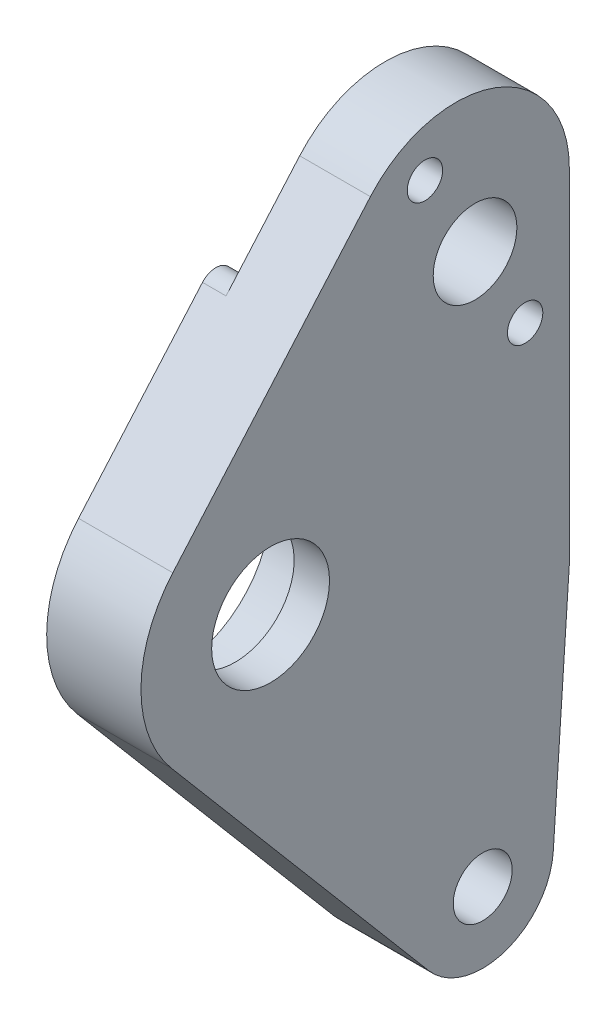
ISO-10303-21;
HEADER;
FILE_DESCRIPTION(('STEP AP214'),'2;1');
FILE_NAME('part.step','',(''),(''),'','','');
FILE_SCHEMA(('AUTOMOTIVE_DESIGN { 1 0 10303 214 1 1 1 1 }'));
ENDSEC;
DATA;
#1=APPLICATION_CONTEXT('core data for automotive mechanical design processes');
#2=APPLICATION_PROTOCOL_DEFINITION('international standard','automotive_design',2000,#1);
#3=PRODUCT_CONTEXT('',#1,'mechanical');
#4=PRODUCT('Part','Part','',(#3));
#5=PRODUCT_RELATED_PRODUCT_CATEGORY('part','',(#4));
#6=PRODUCT_DEFINITION_FORMATION('','',#4);
#7=PRODUCT_DEFINITION_CONTEXT('part definition',#1,'design');
#8=PRODUCT_DEFINITION('design','',#6,#7);
#9=PRODUCT_DEFINITION_SHAPE('','',#8);
#10=(LENGTH_UNIT() NAMED_UNIT(*) SI_UNIT(.MILLI.,.METRE.));
#11=(NAMED_UNIT(*) PLANE_ANGLE_UNIT() SI_UNIT($,.RADIAN.));
#12=(NAMED_UNIT(*) SI_UNIT($,.STERADIAN.) SOLID_ANGLE_UNIT());
#13=UNCERTAINTY_MEASURE_WITH_UNIT(LENGTH_MEASURE(1.E-05),#10,'distance_accuracy_value','');
#14=(GEOMETRIC_REPRESENTATION_CONTEXT(3) GLOBAL_UNCERTAINTY_ASSIGNED_CONTEXT((#13)) GLOBAL_UNIT_ASSIGNED_CONTEXT((#10,
#11,#12)) REPRESENTATION_CONTEXT('',''));
#15=CARTESIAN_POINT('',(0.,0.,0.));
#16=DIRECTION('',(0.,0.,1.));
#17=DIRECTION('',(1.,0.,0.));
#18=AXIS2_PLACEMENT_3D('',#15,#16,#17);
#19=CARTESIAN_POINT('',(8.,57.163003953228,-27.7268073594379));
#20=DIRECTION('',(-1.,0.,0.));
#21=DIRECTION('',(0.,0.,1.));
#22=AXIS2_PLACEMENT_3D('',#19,#20,#21);
#23=CYLINDRICAL_SURFACE('',#22,9.62254421345956);
#24=CARTESIAN_POINT('',(2.,57.163003953228,-27.7268073594379));
#25=DIRECTION('',(-1.,0.,0.));
#26=DIRECTION('',(0.,0.,1.));
#27=AXIS2_PLACEMENT_3D('',#24,#25,#26);
#28=CIRCLE('',#27,9.62254421345956);
#29=CARTESIAN_POINT('',(2.,63.4812229169823,-20.4691585482843));
#30=VERTEX_POINT('',#29);
#31=CARTESIAN_POINT('',(2.,57.163003953228,-37.3493515728975));
#32=VERTEX_POINT('',#31);
#33=EDGE_CURVE('E173',#30,#32,#28,.T.);
#34=ORIENTED_EDGE('',*,*,#33,.F.);
#35=DIRECTION('',(-1.,0.,0.));
#36=VECTOR('',#35,1.);
#37=CARTESIAN_POINT('',(8.,63.4812229169823,-20.4691585482843));
#38=LINE('',#37,#36);
#39=CARTESIAN_POINT('',(8.,63.4812229169823,-20.4691585482843));
#40=VERTEX_POINT('',#39);
#41=EDGE_CURVE('E129',#40,#30,#38,.T.);
#42=ORIENTED_EDGE('',*,*,#41,.F.);
#43=CARTESIAN_POINT('',(8.,57.163003953228,-27.7268073594379));
#44=DIRECTION('',(1.,0.,0.));
#45=DIRECTION('',(0.,0.,-1.));
#46=AXIS2_PLACEMENT_3D('',#43,#44,#45);
#47=CIRCLE('',#46,9.62254421345956);
#48=CARTESIAN_POINT('',(8.,57.163003953228,-37.3493515728975));
#49=VERTEX_POINT('',#48);
#50=EDGE_CURVE('E109',#49,#40,#47,.T.);
#51=ORIENTED_EDGE('',*,*,#50,.F.);
#52=DIRECTION('',(-1.,0.,0.));
#53=VECTOR('',#52,1.);
#54=CARTESIAN_POINT('',(8.,57.163003953228,-37.3493515728975));
#55=LINE('',#54,#53);
#56=EDGE_CURVE('E119',#49,#32,#55,.T.);
#57=ORIENTED_EDGE('',*,*,#56,.T.);
#58=EDGE_LOOP('',(#34,#42,#51,#57));
#59=FACE_BOUND('',#58,.T.);
#60=ADVANCED_FACE('F34',(#59),#23,.T.);
#61=CARTESIAN_POINT('',(8.,44.2226645115419,-3.70342737308271));
#62=DIRECTION('',(0.,-0.656605864685626,-0.754233875174299));
#63=DIRECTION('',(0.,0.7542338751743,-0.656605864685627));
#64=AXIS2_PLACEMENT_3D('',#61,#62,#63);
#65=PLANE('',#64);
#66=DIRECTION('',(-1.,0.,0.));
#67=VECTOR('',#66,1.);
#68=CARTESIAN_POINT('',(2.,56.3048050635649,-14.2216560095));
#69=LINE('',#68,#67);
#70=CARTESIAN_POINT('',(2.,56.3048050635648,-14.2216560095));
#71=VERTEX_POINT('',#70);
#72=CARTESIAN_POINT('',(0.,56.3048050635649,-14.2216560095));
#73=VERTEX_POINT('',#72);
#74=EDGE_CURVE('E242',#71,#73,#69,.T.);
#75=ORIENTED_EDGE('',*,*,#74,.T.);
#76=DIRECTION('',(0.,-0.754233875174299,0.656605864685626));
#77=VECTOR('',#76,1.);
#78=CARTESIAN_POINT('',(0.,44.2226645115419,-3.70342737308271));
#79=LINE('',#78,#77);
#80=CARTESIAN_POINT('',(0.,44.2226645115419,-3.70342737308271));
#81=VERTEX_POINT('',#80);
#82=EDGE_CURVE('E84',#73,#81,#79,.T.);
#83=ORIENTED_EDGE('',*,*,#82,.T.);
#84=DIRECTION('',(-1.,0.,0.));
#85=VECTOR('',#84,1.);
#86=CARTESIAN_POINT('',(8.,44.2226645115419,-3.70342737308271));
#87=LINE('',#86,#85);
#88=CARTESIAN_POINT('',(8.,44.2226645115419,-3.70342737308271));
#89=VERTEX_POINT('',#88);
#90=EDGE_CURVE('E133',#89,#81,#87,.T.);
#91=ORIENTED_EDGE('',*,*,#90,.F.);
#92=DIRECTION('',(0.,-0.754233875174299,0.656605864685626));
#93=VECTOR('',#92,1.);
#94=CARTESIAN_POINT('',(8.,44.2226645115419,-3.70342737308271));
#95=LINE('',#94,#93);
#96=EDGE_CURVE('E60',#40,#89,#95,.T.);
#97=ORIENTED_EDGE('',*,*,#96,.F.);
#98=ORIENTED_EDGE('',*,*,#41,.T.);
#99=DIRECTION('',(0.,0.7542338751743,-0.656605864685627));
#100=VECTOR('',#99,1.);
#101=CARTESIAN_POINT('',(2.,44.2226645115419,-3.70342737308271));
#102=LINE('',#101,#100);
#103=EDGE_CURVE('E249',#71,#30,#102,.T.);
#104=ORIENTED_EDGE('',*,*,#103,.F.);
#105=EDGE_LOOP('',(#75,#83,#91,#97,#98,#104));
#106=FACE_BOUND('',#105,.T.);
#107=ADVANCED_FACE('F270',(#106),#65,.F.);
#108=CARTESIAN_POINT('',(8.,55.,-29.3493515728975));
#109=DIRECTION('',(-1.,0.,0.));
#110=DIRECTION('',(0.,0.,1.));
#111=AXIS2_PLACEMENT_3D('',#108,#109,#110);
#112=CYLINDRICAL_SURFACE('',#111,3.55);
#113=CARTESIAN_POINT('',(8.,55.,-29.3493515728975));
#114=DIRECTION('',(1.,0.,0.));
#115=DIRECTION('',(0.,0.,-1.));
#116=AXIS2_PLACEMENT_3D('',#113,#114,#115);
#117=CIRCLE('',#116,3.55);
#118=CARTESIAN_POINT('',(8.,55.,-32.8993515728975));
#119=VERTEX_POINT('',#118);
#120=EDGE_CURVE('E141',#119,#119,#117,.T.);
#121=ORIENTED_EDGE('',*,*,#120,.T.);
#122=EDGE_LOOP('',(#121));
#123=FACE_BOUND('',#122,.T.);
#124=CARTESIAN_POINT('',(2.,55.,-29.3493515728975));
#125=DIRECTION('',(-1.,0.,0.));
#126=DIRECTION('',(0.,0.,1.));
#127=AXIS2_PLACEMENT_3D('',#124,#125,#126);
#128=CIRCLE('',#127,3.55);
#129=CARTESIAN_POINT('',(2.,55.,-25.7993515728975));
#130=VERTEX_POINT('',#129);
#131=EDGE_CURVE('E38',#130,#130,#128,.T.);
#132=ORIENTED_EDGE('',*,*,#131,.T.);
#133=EDGE_LOOP('',(#132));
#134=FACE_BOUND('',#133,.T.);
#135=ADVANCED_FACE('F256',(#123,#134),#112,.F.);
#136=CARTESIAN_POINT('',(8.,37.,-12.));
#137=DIRECTION('',(-1.,0.,0.));
#138=DIRECTION('',(0.,0.,1.));
#139=AXIS2_PLACEMENT_3D('',#136,#137,#138);
#140=CYLINDRICAL_SURFACE('',#139,5.);
#141=CARTESIAN_POINT('',(8.,37.,-12.));
#142=DIRECTION('',(1.,0.,0.));
#143=DIRECTION('',(0.,0.,-1.));
#144=AXIS2_PLACEMENT_3D('',#141,#142,#143);
#145=CIRCLE('',#144,5.);
#146=CARTESIAN_POINT('',(8.,37.,-17.));
#147=VERTEX_POINT('',#146);
#148=EDGE_CURVE('E190',#147,#147,#145,.T.);
#149=ORIENTED_EDGE('',*,*,#148,.T.);
#150=EDGE_LOOP('',(#149));
#151=FACE_BOUND('',#150,.T.);
#152=CARTESIAN_POINT('',(5.,37.,-12.));
#153=DIRECTION('',(-1.,0.,0.));
#154=DIRECTION('',(0.,0.,1.));
#155=AXIS2_PLACEMENT_3D('',#152,#153,#154);
#156=CIRCLE('',#155,5.);
#157=CARTESIAN_POINT('',(5.,37.,-7.));
#158=VERTEX_POINT('',#157);
#159=EDGE_CURVE('E158',#158,#158,#156,.T.);
#160=ORIENTED_EDGE('',*,*,#159,.T.);
#161=EDGE_LOOP('',(#160));
#162=FACE_BOUND('',#161,.T.);
#163=ADVANCED_FACE('F322',(#151,#162),#140,.F.);
#164=CARTESIAN_POINT('',(8.,37.,-12.));
#165=DIRECTION('',(1.,0.,0.));
#166=DIRECTION('',(0.,0.,-1.));
#167=AXIS2_PLACEMENT_3D('',#164,#165,#166);
#168=PLANE('',#167);
#169=CARTESIAN_POINT('',(8.,62.3612159321677,-25.0993515728975));
#170=DIRECTION('',(1.,0.,0.));
#171=DIRECTION('',(0.,0.,-1.));
#172=AXIS2_PLACEMENT_3D('',#169,#170,#171);
#173=CIRCLE('',#172,1.5);
#174=CARTESIAN_POINT('',(8.,62.3612159321677,-26.5993515728975));
#175=VERTEX_POINT('',#174);
#176=EDGE_CURVE('E364',#175,#175,#173,.F.);
#177=ORIENTED_EDGE('',*,*,#176,.T.);
#178=EDGE_LOOP('',(#177));
#179=FACE_BOUND('',#178,.T.);
#180=CARTESIAN_POINT('',(8.,47.6387840678323,-33.5993515728975));
#181=DIRECTION('',(1.,0.,0.));
#182=DIRECTION('',(0.,0.,-1.));
#183=AXIS2_PLACEMENT_3D('',#180,#181,#182);
#184=CIRCLE('',#183,1.5);
#185=CARTESIAN_POINT('',(8.,47.6387840678323,-35.0993515728975));
#186=VERTEX_POINT('',#185);
#187=EDGE_CURVE('E232',#186,#186,#184,.F.);
#188=ORIENTED_EDGE('',*,*,#187,.T.);
#189=EDGE_LOOP('',(#188));
#190=FACE_BOUND('',#189,.T.);
#191=ORIENTED_EDGE('',*,*,#148,.F.);
#192=EDGE_LOOP('',(#191));
#193=FACE_BOUND('',#192,.T.);
#194=CARTESIAN_POINT('',(8.,37.,-12.));
#195=DIRECTION('',(1.,0.,0.));
#196=DIRECTION('',(0.,0.,-1.));
#197=AXIS2_PLACEMENT_3D('',#194,#195,#196);
#198=CIRCLE('',#197,11.);
#199=CARTESIAN_POINT('',(8.,29.8924897558892,-3.60456682893255));
#200=VERTEX_POINT('',#199);
#201=EDGE_CURVE('E150',#89,#200,#198,.T.);
#202=ORIENTED_EDGE('',*,*,#201,.T.);
#203=DIRECTION('',(0.,-0.763221197369768,-0.646137294919166));
#204=VECTOR('',#203,1.);
#205=CARTESIAN_POINT('',(8.,4.123176230485,-25.4206728157814));
#206=LINE('',#205,#204);
#207=CARTESIAN_POINT('',(8.,4.123176230485,-25.4206728157814));
#208=VERTEX_POINT('',#207);
#209=EDGE_CURVE('E92',#200,#208,#206,.T.);
#210=ORIENTED_EDGE('',*,*,#209,.T.);
#211=CARTESIAN_POINT('',(8.,8.,-30.));
#212=DIRECTION('',(1.,0.,0.));
#213=DIRECTION('',(0.,0.,1.));
#214=AXIS2_PLACEMENT_3D('',#211,#212,#213);
#215=CIRCLE('',#214,6.);
#216=CARTESIAN_POINT('',(8.,7.60009716655463,-35.9866583102598));
#217=VERTEX_POINT('',#216);
#218=EDGE_CURVE('E199',#208,#217,#215,.T.);
#219=ORIENTED_EDGE('',*,*,#218,.T.);
#220=DIRECTION('',(0.,0.997776385043295,-0.0666504722408957));
#221=VECTOR('',#220,1.);
#222=CARTESIAN_POINT('',(8.,28.,-37.3493515728975));
#223=LINE('',#222,#221);
#224=CARTESIAN_POINT('',(8.,28.,-37.3493515728975));
#225=VERTEX_POINT('',#224);
#226=EDGE_CURVE('E112',#217,#225,#223,.T.);
#227=ORIENTED_EDGE('',*,*,#226,.T.);
#228=DIRECTION('',(0.,1.,0.));
#229=VECTOR('',#228,1.);
#230=CARTESIAN_POINT('',(8.,57.163003953228,-37.3493515728975));
#231=LINE('',#230,#229);
#232=EDGE_CURVE('E104',#225,#49,#231,.T.);
#233=ORIENTED_EDGE('',*,*,#232,.T.);
#234=ORIENTED_EDGE('',*,*,#50,.T.);
#235=ORIENTED_EDGE('',*,*,#96,.T.);
#236=EDGE_LOOP('',(#202,#210,#219,#227,#233,#234,#235));
#237=FACE_BOUND('',#236,.T.);
#238=ORIENTED_EDGE('',*,*,#120,.F.);
#239=EDGE_LOOP('',(#238));
#240=FACE_BOUND('',#239,.T.);
#241=CARTESIAN_POINT('',(8.,8.,-30.));
#242=DIRECTION('',(1.,0.,0.));
#243=DIRECTION('',(0.,0.,-1.));
#244=AXIS2_PLACEMENT_3D('',#241,#242,#243);
#245=CIRCLE('',#244,2.5);
#246=CARTESIAN_POINT('',(8.,8.,-32.5));
#247=VERTEX_POINT('',#246);
#248=EDGE_CURVE('E187',#247,#247,#245,.T.);
#249=ORIENTED_EDGE('',*,*,#248,.F.);
#250=EDGE_LOOP('',(#249));
#251=FACE_BOUND('',#250,.T.);
#252=ADVANCED_FACE('F106',(#179,#190,#193,#237,#240,#251),#168,.T.);
#253=CARTESIAN_POINT('',(0.,37.,-12.));
#254=DIRECTION('',(1.,0.,0.));
#255=DIRECTION('',(0.,0.,-1.));
#256=AXIS2_PLACEMENT_3D('',#253,#254,#255);
#257=PLANE('',#256);
#258=CARTESIAN_POINT('',(0.,37.,-12.));
#259=DIRECTION('',(-1.,0.,0.));
#260=DIRECTION('',(0.,0.,1.));
#261=AXIS2_PLACEMENT_3D('',#258,#259,#260);
#262=CIRCLE('',#261,7.99);
#263=CARTESIAN_POINT('',(0.,37.,-4.01));
#264=VERTEX_POINT('',#263);
#265=EDGE_CURVE('E168',#264,#264,#262,.T.);
#266=ORIENTED_EDGE('',*,*,#265,.F.);
#267=EDGE_LOOP('',(#266));
#268=FACE_BOUND('',#267,.T.);
#269=CARTESIAN_POINT('',(0.,55.,-29.3493515728975));
#270=DIRECTION('',(-1.,0.,0.));
#271=DIRECTION('',(0.,0.,1.));
#272=AXIS2_PLACEMENT_3D('',#269,#270,#271);
#273=CIRCLE('',#272,12.5);
#274=CARTESIAN_POINT('',(0.,43.9289314574667,-35.1529230014689));
#275=VERTEX_POINT('',#274);
#276=CARTESIAN_POINT('',(0.,55.2856216665504,-16.852615188401));
#277=VERTEX_POINT('',#276);
#278=EDGE_CURVE('E220',#275,#277,#273,.T.);
#279=ORIENTED_EDGE('',*,*,#278,.F.);
#280=CARTESIAN_POINT('',(0.,42.6004032323628,-35.8493515728975));
#281=DIRECTION('',(1.,0.,0.));
#282=DIRECTION('',(0.,0.,1.));
#283=AXIS2_PLACEMENT_3D('',#280,#281,#282);
#284=CIRCLE('',#283,1.49999999999999);
#285=CARTESIAN_POINT('',(0.,42.6004032323628,-37.3493515728975));
#286=VERTEX_POINT('',#285);
#287=EDGE_CURVE('E216',#286,#275,#284,.T.);
#288=ORIENTED_EDGE('',*,*,#287,.F.);
#289=DIRECTION('',(0.,1.,0.));
#290=VECTOR('',#289,1.);
#291=CARTESIAN_POINT('',(0.,57.163003953228,-37.3493515728975));
#292=LINE('',#291,#290);
#293=CARTESIAN_POINT('',(0.,28.,-37.3493515728975));
#294=VERTEX_POINT('',#293);
#295=EDGE_CURVE('E147',#294,#286,#292,.T.);
#296=ORIENTED_EDGE('',*,*,#295,.F.);
#297=DIRECTION('',(0.,0.997776385043295,-0.0666504722408957));
#298=VECTOR('',#297,1.);
#299=CARTESIAN_POINT('',(0.,28.,-37.3493515728975));
#300=LINE('',#299,#298);
#301=CARTESIAN_POINT('',(0.,7.60009716655463,-35.9866583102598));
#302=VERTEX_POINT('',#301);
#303=EDGE_CURVE('E145',#302,#294,#300,.T.);
#304=ORIENTED_EDGE('',*,*,#303,.F.);
#305=CARTESIAN_POINT('',(0.,8.,-30.));
#306=DIRECTION('',(1.,0.,0.));
#307=DIRECTION('',(0.,0.,1.));
#308=AXIS2_PLACEMENT_3D('',#305,#306,#307);
#309=CIRCLE('',#308,6.);
#310=CARTESIAN_POINT('',(0.,4.123176230485,-25.4206728157814));
#311=VERTEX_POINT('',#310);
#312=EDGE_CURVE('E143',#311,#302,#309,.T.);
#313=ORIENTED_EDGE('',*,*,#312,.F.);
#314=DIRECTION('',(0.,-0.763221197369768,-0.646137294919166));
#315=VECTOR('',#314,1.);
#316=CARTESIAN_POINT('',(0.,4.123176230485,-25.4206728157814));
#317=LINE('',#316,#315);
#318=CARTESIAN_POINT('',(0.,29.8924897558892,-3.60456682893255));
#319=VERTEX_POINT('',#318);
#320=EDGE_CURVE('E140',#319,#311,#317,.T.);
#321=ORIENTED_EDGE('',*,*,#320,.F.);
#322=CARTESIAN_POINT('',(0.,37.,-12.));
#323=DIRECTION('',(1.,0.,0.));
#324=DIRECTION('',(0.,0.,-1.));
#325=AXIS2_PLACEMENT_3D('',#322,#323,#324);
#326=CIRCLE('',#325,11.);
#327=EDGE_CURVE('E137',#81,#319,#326,.T.);
#328=ORIENTED_EDGE('',*,*,#327,.F.);
#329=ORIENTED_EDGE('',*,*,#82,.F.);
#330=CARTESIAN_POINT('',(0.,55.3198962665364,-15.3530068222615));
#331=DIRECTION('',(1.,0.,0.));
#332=DIRECTION('',(0.,0.,-1.));
#333=AXIS2_PLACEMENT_3D('',#330,#331,#332);
#334=CIRCLE('',#333,1.50000000000001);
#335=EDGE_CURVE('E229',#277,#73,#334,.T.);
#336=ORIENTED_EDGE('',*,*,#335,.F.);
#337=EDGE_LOOP('',(#279,#288,#296,#304,#313,#321,#328,#329,#336));
#338=FACE_BOUND('',#337,.T.);
#339=CARTESIAN_POINT('',(0.,8.,-30.));
#340=DIRECTION('',(1.,0.,0.));
#341=DIRECTION('',(0.,0.,-1.));
#342=AXIS2_PLACEMENT_3D('',#339,#340,#341);
#343=CIRCLE('',#342,2.5);
#344=CARTESIAN_POINT('',(0.,8.,-32.5));
#345=VERTEX_POINT('',#344);
#346=EDGE_CURVE('E186',#345,#345,#343,.T.);
#347=ORIENTED_EDGE('',*,*,#346,.T.);
#348=EDGE_LOOP('',(#347));
#349=FACE_BOUND('',#348,.T.);
#350=ADVANCED_FACE('F213',(#268,#338,#349),#257,.F.);
#351=CARTESIAN_POINT('',(8.,37.,-12.));
#352=DIRECTION('',(-1.,0.,0.));
#353=DIRECTION('',(0.,0.,1.));
#354=AXIS2_PLACEMENT_3D('',#351,#352,#353);
#355=CYLINDRICAL_SURFACE('',#354,11.);
#356=ORIENTED_EDGE('',*,*,#327,.T.);
#357=DIRECTION('',(-1.,0.,0.));
#358=VECTOR('',#357,1.);
#359=CARTESIAN_POINT('',(8.,29.8924897558892,-3.60456682893255));
#360=LINE('',#359,#358);
#361=EDGE_CURVE('E11',#200,#319,#360,.T.);
#362=ORIENTED_EDGE('',*,*,#361,.F.);
#363=ORIENTED_EDGE('',*,*,#201,.F.);
#364=ORIENTED_EDGE('',*,*,#90,.T.);
#365=EDGE_LOOP('',(#356,#362,#363,#364));
#366=FACE_BOUND('',#365,.T.);
#367=ADVANCED_FACE('F36',(#366),#355,.T.);
#368=CARTESIAN_POINT('',(8.,4.123176230485,-25.4206728157814));
#369=DIRECTION('',(0.,0.646137294919166,-0.763221197369768));
#370=DIRECTION('',(0.,0.763221197369768,0.646137294919166));
#371=AXIS2_PLACEMENT_3D('',#368,#369,#370);
#372=PLANE('',#371);
#373=ORIENTED_EDGE('',*,*,#320,.T.);
#374=DIRECTION('',(-1.,0.,0.));
#375=VECTOR('',#374,1.);
#376=CARTESIAN_POINT('',(8.,4.123176230485,-25.4206728157814));
#377=LINE('',#376,#375);
#378=EDGE_CURVE('E43',#208,#311,#377,.T.);
#379=ORIENTED_EDGE('',*,*,#378,.F.);
#380=ORIENTED_EDGE('',*,*,#209,.F.);
#381=ORIENTED_EDGE('',*,*,#361,.T.);
#382=EDGE_LOOP('',(#373,#379,#380,#381));
#383=FACE_BOUND('',#382,.T.);
#384=ADVANCED_FACE('F275',(#383),#372,.F.);
#385=CARTESIAN_POINT('',(8.,8.,-30.));
#386=DIRECTION('',(-1.,0.,0.));
#387=DIRECTION('',(0.,0.,1.));
#388=AXIS2_PLACEMENT_3D('',#385,#386,#387);
#389=CYLINDRICAL_SURFACE('',#388,6.);
#390=ORIENTED_EDGE('',*,*,#312,.T.);
#391=DIRECTION('',(-1.,0.,0.));
#392=VECTOR('',#391,1.);
#393=CARTESIAN_POINT('',(8.,7.60009716655463,-35.9866583102598));
#394=LINE('',#393,#392);
#395=EDGE_CURVE('E154',#217,#302,#394,.T.);
#396=ORIENTED_EDGE('',*,*,#395,.F.);
#397=ORIENTED_EDGE('',*,*,#218,.F.);
#398=ORIENTED_EDGE('',*,*,#378,.T.);
#399=EDGE_LOOP('',(#390,#396,#397,#398));
#400=FACE_BOUND('',#399,.T.);
#401=ADVANCED_FACE('F203',(#400),#389,.T.);
#402=CARTESIAN_POINT('',(8.,28.,-37.3493515728975));
#403=DIRECTION('',(0.,0.0666504722408957,0.997776385043295));
#404=DIRECTION('',(0.,-0.997776385043295,0.0666504722408957));
#405=AXIS2_PLACEMENT_3D('',#402,#403,#404);
#406=PLANE('',#405);
#407=ORIENTED_EDGE('',*,*,#303,.T.);
#408=DIRECTION('',(-1.,0.,0.));
#409=VECTOR('',#408,1.);
#410=CARTESIAN_POINT('',(8.,28.,-37.3493515728975));
#411=LINE('',#410,#409);
#412=EDGE_CURVE('E128',#225,#294,#411,.T.);
#413=ORIENTED_EDGE('',*,*,#412,.F.);
#414=ORIENTED_EDGE('',*,*,#226,.F.);
#415=ORIENTED_EDGE('',*,*,#395,.T.);
#416=EDGE_LOOP('',(#407,#413,#414,#415));
#417=FACE_BOUND('',#416,.T.);
#418=ADVANCED_FACE('F207',(#417),#406,.F.);
#419=CARTESIAN_POINT('',(8.,57.163003953228,-37.3493515728975));
#420=DIRECTION('',(0.,0.,1.));
#421=DIRECTION('',(0.,-1.,0.));
#422=AXIS2_PLACEMENT_3D('',#419,#420,#421);
#423=PLANE('',#422);
#424=CARTESIAN_POINT('',(5.,44.,-37.3493515728975));
#425=DIRECTION('',(0.,0.,-1.));
#426=DIRECTION('',(0.,1.,0.));
#427=AXIS2_PLACEMENT_3D('',#424,#425,#426);
#428=CIRCLE('',#427,1.24999999999999);
#429=CARTESIAN_POINT('',(5.,45.25,-37.3493515728975));
#430=VERTEX_POINT('',#429);
#431=EDGE_CURVE('E160',#430,#430,#428,.T.);
#432=ORIENTED_EDGE('',*,*,#431,.F.);
#433=EDGE_LOOP('',(#432));
#434=FACE_BOUND('',#433,.T.);
#435=CARTESIAN_POINT('',(5.,32.,-37.3493515728975));
#436=DIRECTION('',(0.,0.,-1.));
#437=DIRECTION('',(0.,1.,0.));
#438=AXIS2_PLACEMENT_3D('',#435,#436,#437);
#439=CIRCLE('',#438,1.24999999999999);
#440=CARTESIAN_POINT('',(5.,33.25,-37.3493515728975));
#441=VERTEX_POINT('',#440);
#442=EDGE_CURVE('E180',#441,#441,#439,.T.);
#443=ORIENTED_EDGE('',*,*,#442,.F.);
#444=EDGE_LOOP('',(#443));
#445=FACE_BOUND('',#444,.T.);
#446=ORIENTED_EDGE('',*,*,#295,.T.);
#447=DIRECTION('',(-1.,0.,0.));
#448=VECTOR('',#447,1.);
#449=CARTESIAN_POINT('',(2.,42.6004032323628,-37.3493515728975));
#450=LINE('',#449,#448);
#451=CARTESIAN_POINT('',(2.,42.6004032323628,-37.3493515728975));
#452=VERTEX_POINT('',#451);
#453=EDGE_CURVE('E240',#452,#286,#450,.T.);
#454=ORIENTED_EDGE('',*,*,#453,.F.);
#455=DIRECTION('',(0.,-1.,0.));
#456=VECTOR('',#455,1.);
#457=CARTESIAN_POINT('',(2.,42.6004032323628,-37.3493515728975));
#458=LINE('',#457,#456);
#459=EDGE_CURVE('E125',#32,#452,#458,.T.);
#460=ORIENTED_EDGE('',*,*,#459,.F.);
#461=ORIENTED_EDGE('',*,*,#56,.F.);
#462=ORIENTED_EDGE('',*,*,#232,.F.);
#463=ORIENTED_EDGE('',*,*,#412,.T.);
#464=EDGE_LOOP('',(#446,#454,#460,#461,#462,#463));
#465=FACE_BOUND('',#464,.T.);
#466=ADVANCED_FACE('F121',(#434,#445,#465),#423,.F.);
#467=CARTESIAN_POINT('',(8.,8.,-30.));
#468=DIRECTION('',(-1.,0.,0.));
#469=DIRECTION('',(0.,0.,1.));
#470=AXIS2_PLACEMENT_3D('',#467,#468,#469);
#471=CYLINDRICAL_SURFACE('',#470,2.5);
#472=ORIENTED_EDGE('',*,*,#248,.T.);
#473=EDGE_LOOP('',(#472));
#474=FACE_BOUND('',#473,.T.);
#475=ORIENTED_EDGE('',*,*,#346,.F.);
#476=EDGE_LOOP('',(#475));
#477=FACE_BOUND('',#476,.T.);
#478=ADVANCED_FACE('F289',(#474,#477),#471,.F.);
#479=CARTESIAN_POINT('',(5.,32.,-27.3493515728975));
#480=DIRECTION('',(0.,0.,-1.));
#481=DIRECTION('',(0.,1.,0.));
#482=AXIS2_PLACEMENT_3D('',#479,#480,#481);
#483=CONICAL_SURFACE('',#482,1.24999999999999,1.02974425867665);
#484=CARTESIAN_POINT('',(5.,32.,-26.5982757991131));
#485=VERTEX_POINT('',#484);
#486=VERTEX_LOOP('',#485);
#487=FACE_BOUND('',#486,.T.);
#488=CARTESIAN_POINT('',(5.,32.,-27.3493515728975));
#489=DIRECTION('',(0.,0.,-1.));
#490=DIRECTION('',(0.,1.,0.));
#491=AXIS2_PLACEMENT_3D('',#488,#489,#490);
#492=CIRCLE('',#491,1.24999999999999);
#493=CARTESIAN_POINT('',(5.,33.25,-27.3493515728975));
#494=VERTEX_POINT('',#493);
#495=EDGE_CURVE('E183',#494,#494,#492,.T.);
#496=ORIENTED_EDGE('',*,*,#495,.T.);
#497=EDGE_LOOP('',(#496));
#498=FACE_BOUND('',#497,.T.);
#499=ADVANCED_FACE('F285',(#487,#498),#483,.F.);
#500=CARTESIAN_POINT('',(5.,32.,-37.3493515728975));
#501=DIRECTION('',(0.,0.,-1.));
#502=DIRECTION('',(0.,1.,0.));
#503=AXIS2_PLACEMENT_3D('',#500,#501,#502);
#504=CYLINDRICAL_SURFACE('',#503,1.24999999999999);
#505=ORIENTED_EDGE('',*,*,#495,.F.);
#506=EDGE_LOOP('',(#505));
#507=FACE_BOUND('',#506,.T.);
#508=ORIENTED_EDGE('',*,*,#442,.T.);
#509=EDGE_LOOP('',(#508));
#510=FACE_BOUND('',#509,.T.);
#511=ADVANCED_FACE('F288',(#507,#510),#504,.F.);
#512=CARTESIAN_POINT('',(5.,44.,-27.3493515728975));
#513=DIRECTION('',(0.,0.,-1.));
#514=DIRECTION('',(0.,1.,0.));
#515=AXIS2_PLACEMENT_3D('',#512,#513,#514);
#516=CONICAL_SURFACE('',#515,1.24999999999999,1.02974425867665);
#517=CARTESIAN_POINT('',(5.,44.,-26.5982757991131));
#518=VERTEX_POINT('',#517);
#519=VERTEX_LOOP('',#518);
#520=FACE_BOUND('',#519,.T.);
#521=CARTESIAN_POINT('',(5.,44.,-27.3493515728975));
#522=DIRECTION('',(0.,0.,-1.));
#523=DIRECTION('',(0.,1.,0.));
#524=AXIS2_PLACEMENT_3D('',#521,#522,#523);
#525=CIRCLE('',#524,1.24999999999999);
#526=CARTESIAN_POINT('',(5.,45.25,-27.3493515728975));
#527=VERTEX_POINT('',#526);
#528=EDGE_CURVE('E165',#527,#527,#525,.T.);
#529=ORIENTED_EDGE('',*,*,#528,.T.);
#530=EDGE_LOOP('',(#529));
#531=FACE_BOUND('',#530,.T.);
#532=ADVANCED_FACE('F295',(#520,#531),#516,.F.);
#533=CARTESIAN_POINT('',(5.,44.,-37.3493515728975));
#534=DIRECTION('',(0.,0.,-1.));
#535=DIRECTION('',(0.,1.,0.));
#536=AXIS2_PLACEMENT_3D('',#533,#534,#535);
#537=CYLINDRICAL_SURFACE('',#536,1.24999999999999);
#538=ORIENTED_EDGE('',*,*,#528,.F.);
#539=EDGE_LOOP('',(#538));
#540=FACE_BOUND('',#539,.T.);
#541=ORIENTED_EDGE('',*,*,#431,.T.);
#542=EDGE_LOOP('',(#541));
#543=FACE_BOUND('',#542,.T.);
#544=ADVANCED_FACE('F332',(#540,#543),#537,.F.);
#545=CARTESIAN_POINT('',(5.,37.,-12.));
#546=DIRECTION('',(-1.,0.,0.));
#547=DIRECTION('',(0.,0.,1.));
#548=AXIS2_PLACEMENT_3D('',#545,#546,#547);
#549=CYLINDRICAL_SURFACE('',#548,7.99);
#550=CARTESIAN_POINT('',(5.,37.,-12.));
#551=DIRECTION('',(-1.,0.,0.));
#552=DIRECTION('',(0.,0.,1.));
#553=AXIS2_PLACEMENT_3D('',#550,#551,#552);
#554=CIRCLE('',#553,7.99);
#555=CARTESIAN_POINT('',(5.,37.,-4.01));
#556=VERTEX_POINT('',#555);
#557=EDGE_CURVE('E161',#556,#556,#554,.T.);
#558=ORIENTED_EDGE('',*,*,#557,.F.);
#559=EDGE_LOOP('',(#558));
#560=FACE_BOUND('',#559,.T.);
#561=ORIENTED_EDGE('',*,*,#265,.T.);
#562=EDGE_LOOP('',(#561));
#563=FACE_BOUND('',#562,.T.);
#564=ADVANCED_FACE('F335',(#560,#563),#549,.F.);
#565=CARTESIAN_POINT('',(5.,37.,-12.));
#566=DIRECTION('',(-1.,0.,0.));
#567=DIRECTION('',(0.,0.,1.));
#568=AXIS2_PLACEMENT_3D('',#565,#566,#567);
#569=PLANE('',#568);
#570=ORIENTED_EDGE('',*,*,#159,.F.);
#571=EDGE_LOOP('',(#570));
#572=FACE_BOUND('',#571,.T.);
#573=ORIENTED_EDGE('',*,*,#557,.T.);
#574=EDGE_LOOP('',(#573));
#575=FACE_BOUND('',#574,.T.);
#576=ADVANCED_FACE('F261',(#572,#575),#569,.T.);
#577=CARTESIAN_POINT('',(2.,42.6004032323628,-35.8493515728975));
#578=DIRECTION('',(-1.,0.,0.));
#579=DIRECTION('',(0.,0.,1.));
#580=AXIS2_PLACEMENT_3D('',#577,#578,#579);
#581=PLANE('',#580);
#582=CARTESIAN_POINT('',(2.,62.3612159321677,-25.0993515728975));
#583=DIRECTION('',(-1.,0.,0.));
#584=DIRECTION('',(0.,0.,1.));
#585=AXIS2_PLACEMENT_3D('',#582,#583,#584);
#586=CIRCLE('',#585,1.5);
#587=CARTESIAN_POINT('',(2.,62.3612159321677,-23.5993515728975));
#588=VERTEX_POINT('',#587);
#589=EDGE_CURVE('E367',#588,#588,#586,.T.);
#590=ORIENTED_EDGE('',*,*,#589,.F.);
#591=EDGE_LOOP('',(#590));
#592=FACE_BOUND('',#591,.T.);
#593=CARTESIAN_POINT('',(2.,47.6387840678323,-33.5993515728975));
#594=DIRECTION('',(-1.,0.,0.));
#595=DIRECTION('',(0.,0.,1.));
#596=AXIS2_PLACEMENT_3D('',#593,#594,#595);
#597=CIRCLE('',#596,1.5);
#598=CARTESIAN_POINT('',(2.,47.6387840678323,-32.0993515728975));
#599=VERTEX_POINT('',#598);
#600=EDGE_CURVE('E227',#599,#599,#597,.T.);
#601=ORIENTED_EDGE('',*,*,#600,.F.);
#602=EDGE_LOOP('',(#601));
#603=FACE_BOUND('',#602,.T.);
#604=ORIENTED_EDGE('',*,*,#131,.F.);
#605=EDGE_LOOP('',(#604));
#606=FACE_BOUND('',#605,.T.);
#607=ORIENTED_EDGE('',*,*,#33,.T.);
#608=ORIENTED_EDGE('',*,*,#459,.T.);
#609=CARTESIAN_POINT('',(2.,42.6004032323628,-35.8493515728975));
#610=DIRECTION('',(1.,0.,0.));
#611=DIRECTION('',(0.,0.,1.));
#612=AXIS2_PLACEMENT_3D('',#609,#610,#611);
#613=CIRCLE('',#612,1.49999999999999);
#614=CARTESIAN_POINT('',(2.,43.9289314574667,-35.1529230014689));
#615=VERTEX_POINT('',#614);
#616=EDGE_CURVE('E239',#452,#615,#613,.T.);
#617=ORIENTED_EDGE('',*,*,#616,.T.);
#618=CARTESIAN_POINT('',(2.,55.,-29.3493515728975));
#619=DIRECTION('',(-1.,0.,0.));
#620=DIRECTION('',(0.,0.,1.));
#621=AXIS2_PLACEMENT_3D('',#618,#619,#620);
#622=CIRCLE('',#621,12.5);
#623=CARTESIAN_POINT('',(2.,55.2856216665504,-16.852615188401));
#624=VERTEX_POINT('',#623);
#625=EDGE_CURVE('E374',#615,#624,#622,.T.);
#626=ORIENTED_EDGE('',*,*,#625,.T.);
#627=CARTESIAN_POINT('',(2.,55.3198962665364,-15.3530068222615));
#628=DIRECTION('',(1.,0.,0.));
#629=DIRECTION('',(0.,0.,-1.));
#630=AXIS2_PLACEMENT_3D('',#627,#628,#629);
#631=CIRCLE('',#630,1.50000000000001);
#632=EDGE_CURVE('E51',#624,#71,#631,.T.);
#633=ORIENTED_EDGE('',*,*,#632,.T.);
#634=ORIENTED_EDGE('',*,*,#103,.T.);
#635=EDGE_LOOP('',(#607,#608,#617,#626,#633,#634));
#636=FACE_BOUND('',#635,.T.);
#637=ADVANCED_FACE('F258',(#592,#603,#606,#636),#581,.T.);
#638=CARTESIAN_POINT('',(2.,42.6004032323628,-35.8493515728975));
#639=DIRECTION('',(-1.,0.,0.));
#640=DIRECTION('',(0.,0.,1.));
#641=AXIS2_PLACEMENT_3D('',#638,#639,#640);
#642=CYLINDRICAL_SURFACE('',#641,1.49999999999999);
#643=ORIENTED_EDGE('',*,*,#287,.T.);
#644=DIRECTION('',(-1.,0.,0.));
#645=VECTOR('',#644,1.);
#646=CARTESIAN_POINT('',(2.,43.9289314574667,-35.1529230014689));
#647=LINE('',#646,#645);
#648=EDGE_CURVE('E247',#615,#275,#647,.T.);
#649=ORIENTED_EDGE('',*,*,#648,.F.);
#650=ORIENTED_EDGE('',*,*,#616,.F.);
#651=ORIENTED_EDGE('',*,*,#453,.T.);
#652=EDGE_LOOP('',(#643,#649,#650,#651));
#653=FACE_BOUND('',#652,.T.);
#654=ADVANCED_FACE('F260',(#653),#642,.T.);
#655=CARTESIAN_POINT('',(2.,55.3198962665364,-15.3530068222615));
#656=DIRECTION('',(-1.,0.,0.));
#657=DIRECTION('',(0.,0.,1.));
#658=AXIS2_PLACEMENT_3D('',#655,#656,#657);
#659=CYLINDRICAL_SURFACE('',#658,1.50000000000001);
#660=ORIENTED_EDGE('',*,*,#335,.T.);
#661=ORIENTED_EDGE('',*,*,#74,.F.);
#662=ORIENTED_EDGE('',*,*,#632,.F.);
#663=DIRECTION('',(-1.,0.,0.));
#664=VECTOR('',#663,1.);
#665=CARTESIAN_POINT('',(2.,55.2856216665504,-16.852615188401));
#666=LINE('',#665,#664);
#667=EDGE_CURVE('E244',#624,#277,#666,.T.);
#668=ORIENTED_EDGE('',*,*,#667,.T.);
#669=EDGE_LOOP('',(#660,#661,#662,#668));
#670=FACE_BOUND('',#669,.T.);
#671=ADVANCED_FACE('F345',(#670),#659,.T.);
#672=CARTESIAN_POINT('',(2.,55.,-29.3493515728975));
#673=DIRECTION('',(-1.,0.,0.));
#674=DIRECTION('',(0.,0.,1.));
#675=AXIS2_PLACEMENT_3D('',#672,#673,#674);
#676=CYLINDRICAL_SURFACE('',#675,12.5);
#677=ORIENTED_EDGE('',*,*,#278,.T.);
#678=ORIENTED_EDGE('',*,*,#667,.F.);
#679=ORIENTED_EDGE('',*,*,#625,.F.);
#680=ORIENTED_EDGE('',*,*,#648,.T.);
#681=EDGE_LOOP('',(#677,#678,#679,#680));
#682=FACE_BOUND('',#681,.T.);
#683=ADVANCED_FACE('F346',(#682),#676,.F.);
#684=CARTESIAN_POINT('',(8.001,47.6387840678323,-33.5993515728975));
#685=DIRECTION('',(-1.,0.,0.));
#686=DIRECTION('',(0.,0.,1.));
#687=AXIS2_PLACEMENT_3D('',#684,#685,#686);
#688=CYLINDRICAL_SURFACE('',#687,1.5);
#689=ORIENTED_EDGE('',*,*,#187,.F.);
#690=EDGE_LOOP('',(#689));
#691=FACE_BOUND('',#690,.T.);
#692=ORIENTED_EDGE('',*,*,#600,.T.);
#693=EDGE_LOOP('',(#692));
#694=FACE_BOUND('',#693,.T.);
#695=ADVANCED_FACE('F349',(#691,#694),#688,.F.);
#696=CARTESIAN_POINT('',(8.001,62.3612159321677,-25.0993515728975));
#697=DIRECTION('',(-1.,0.,0.));
#698=DIRECTION('',(0.,0.,1.));
#699=AXIS2_PLACEMENT_3D('',#696,#697,#698);
#700=CYLINDRICAL_SURFACE('',#699,1.5);
#701=ORIENTED_EDGE('',*,*,#176,.F.);
#702=EDGE_LOOP('',(#701));
#703=FACE_BOUND('',#702,.T.);
#704=ORIENTED_EDGE('',*,*,#589,.T.);
#705=EDGE_LOOP('',(#704));
#706=FACE_BOUND('',#705,.T.);
#707=ADVANCED_FACE('F355',(#703,#706),#700,.F.);
#708=CLOSED_SHELL('',(#60,#107,#135,#163,#252,#350,#367,#384,#401,#418,#466,#478,#499,#511,#532,
#544,#564,#576,#637,#654,#671,#683,#695,#707));
#709=MANIFOLD_SOLID_BREP('B2',#708);
#710=ADVANCED_BREP_SHAPE_REPRESENTATION('',(#18,#709),#14);
#711=SHAPE_DEFINITION_REPRESENTATION(#9,#710);
ENDSEC;
END-ISO-10303-21;
